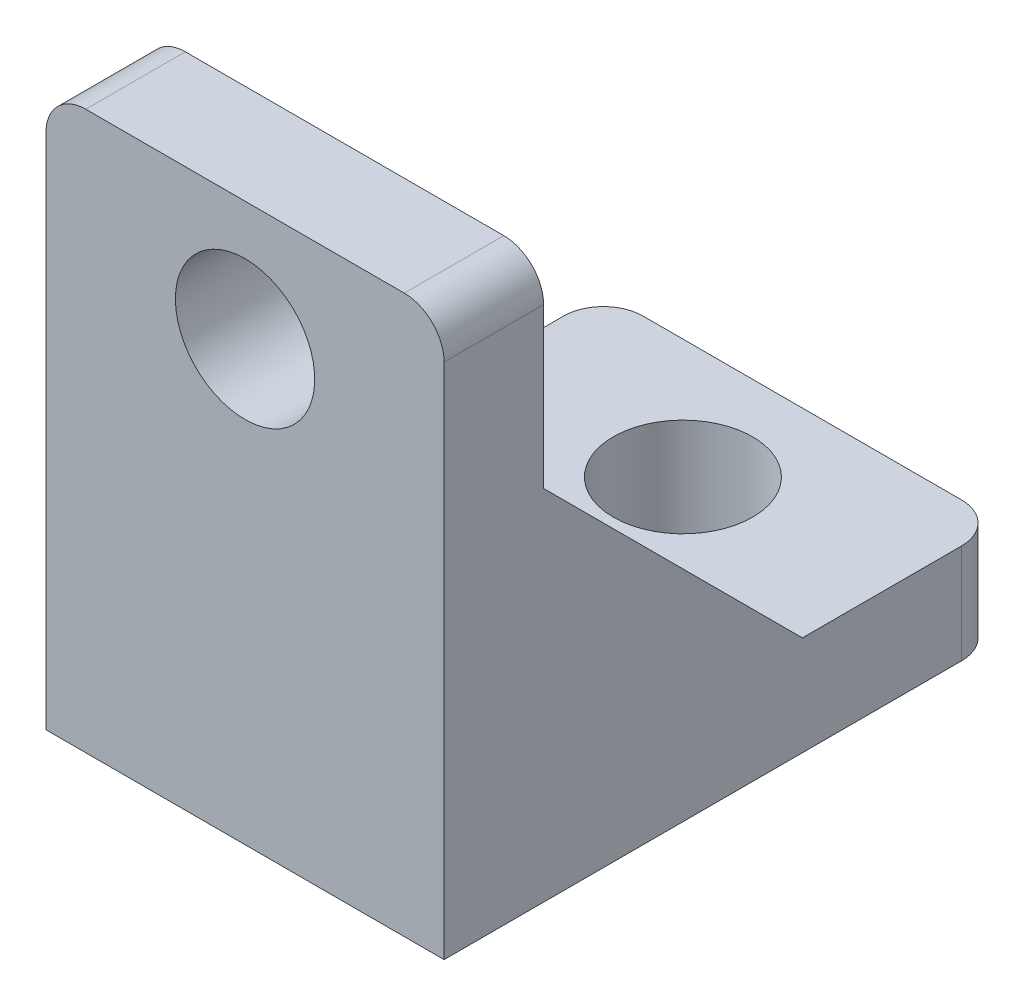
ISO-10303-21;
HEADER;
FILE_DESCRIPTION(('STEP AP214'),'2;1');
FILE_NAME('part.step','',(''),(''),'','','');
FILE_SCHEMA(('AUTOMOTIVE_DESIGN { 1 0 10303 214 1 1 1 1 }'));
ENDSEC;
DATA;
#1=APPLICATION_CONTEXT('core data for automotive mechanical design processes');
#2=APPLICATION_PROTOCOL_DEFINITION('international standard','automotive_design',2000,#1);
#3=PRODUCT_CONTEXT('',#1,'mechanical');
#4=PRODUCT('Part','Part','',(#3));
#5=PRODUCT_RELATED_PRODUCT_CATEGORY('part','',(#4));
#6=PRODUCT_DEFINITION_FORMATION('','',#4);
#7=PRODUCT_DEFINITION_CONTEXT('part definition',#1,'design');
#8=PRODUCT_DEFINITION('design','',#6,#7);
#9=PRODUCT_DEFINITION_SHAPE('','',#8);
#10=(LENGTH_UNIT() NAMED_UNIT(*) SI_UNIT(.MILLI.,.METRE.));
#11=(NAMED_UNIT(*) PLANE_ANGLE_UNIT() SI_UNIT($,.RADIAN.));
#12=(NAMED_UNIT(*) SI_UNIT($,.STERADIAN.) SOLID_ANGLE_UNIT());
#13=UNCERTAINTY_MEASURE_WITH_UNIT(LENGTH_MEASURE(1.E-05),#10,'distance_accuracy_value','');
#14=(GEOMETRIC_REPRESENTATION_CONTEXT(3) GLOBAL_UNCERTAINTY_ASSIGNED_CONTEXT((#13)) GLOBAL_UNIT_ASSIGNED_CONTEXT((#10,
#11,#12)) REPRESENTATION_CONTEXT('',''));
#15=CARTESIAN_POINT('',(0.,0.,0.));
#16=DIRECTION('',(0.,0.,1.));
#17=DIRECTION('',(1.,0.,0.));
#18=AXIS2_PLACEMENT_3D('',#15,#16,#17);
#19=CARTESIAN_POINT('',(20.,0.,-28.));
#20=DIRECTION('',(0.,1.,0.));
#21=DIRECTION('',(0.,0.,1.));
#22=AXIS2_PLACEMENT_3D('',#19,#20,#21);
#23=PLANE('',#22);
#24=CARTESIAN_POINT('',(10.,0.,-22.));
#25=DIRECTION('',(0.,1.,0.));
#26=DIRECTION('',(0.,0.,1.));
#27=AXIS2_PLACEMENT_3D('',#24,#25,#26);
#28=CIRCLE('',#27,3.5);
#29=CARTESIAN_POINT('',(10.,0.,-18.5));
#30=VERTEX_POINT('',#29);
#31=EDGE_CURVE('E300',#30,#30,#28,.F.);
#32=ORIENTED_EDGE('',*,*,#31,.F.);
#33=EDGE_LOOP('',(#32));
#34=FACE_BOUND('',#33,.T.);
#35=DIRECTION('',(0.,0.,-1.));
#36=VECTOR('',#35,1.);
#37=CARTESIAN_POINT('',(0.,0.,-28.));
#38=LINE('',#37,#36);
#39=CARTESIAN_POINT('',(0.,0.,0.));
#40=VERTEX_POINT('',#39);
#41=CARTESIAN_POINT('',(0.,0.,-26.));
#42=VERTEX_POINT('',#41);
#43=EDGE_CURVE('E171',#40,#42,#38,.T.);
#44=ORIENTED_EDGE('',*,*,#43,.T.);
#45=CARTESIAN_POINT('',(2.,0.,-26.));
#46=DIRECTION('',(0.,1.,0.));
#47=DIRECTION('',(0.,0.,1.));
#48=AXIS2_PLACEMENT_3D('',#45,#46,#47);
#49=CIRCLE('',#48,2.);
#50=CARTESIAN_POINT('',(2.,0.,-28.));
#51=VERTEX_POINT('',#50);
#52=EDGE_CURVE('E233',#42,#51,#49,.F.);
#53=ORIENTED_EDGE('',*,*,#52,.T.);
#54=DIRECTION('',(-1.,0.,0.));
#55=VECTOR('',#54,1.);
#56=CARTESIAN_POINT('',(20.,0.,-28.));
#57=LINE('',#56,#55);
#58=CARTESIAN_POINT('',(18.,0.,-28.));
#59=VERTEX_POINT('',#58);
#60=EDGE_CURVE('E204',#59,#51,#57,.T.);
#61=ORIENTED_EDGE('',*,*,#60,.F.);
#62=CARTESIAN_POINT('',(18.,0.,-26.));
#63=DIRECTION('',(0.,1.,0.));
#64=DIRECTION('',(0.,0.,1.));
#65=AXIS2_PLACEMENT_3D('',#62,#63,#64);
#66=CIRCLE('',#65,2.);
#67=CARTESIAN_POINT('',(20.,0.,-26.));
#68=VERTEX_POINT('',#67);
#69=EDGE_CURVE('E231',#59,#68,#66,.F.);
#70=ORIENTED_EDGE('',*,*,#69,.T.);
#71=DIRECTION('',(0.,0.,-1.));
#72=VECTOR('',#71,1.);
#73=CARTESIAN_POINT('',(20.,0.,-28.));
#74=LINE('',#73,#72);
#75=CARTESIAN_POINT('',(20.,0.,0.));
#76=VERTEX_POINT('',#75);
#77=EDGE_CURVE('E176',#76,#68,#74,.T.);
#78=ORIENTED_EDGE('',*,*,#77,.F.);
#79=DIRECTION('',(-1.,0.,0.));
#80=VECTOR('',#79,1.);
#81=CARTESIAN_POINT('',(20.,0.,0.));
#82=LINE('',#81,#80);
#83=EDGE_CURVE('E185',#76,#40,#82,.T.);
#84=ORIENTED_EDGE('',*,*,#83,.T.);
#85=EDGE_LOOP('',(#44,#53,#61,#70,#78,#84));
#86=FACE_BOUND('',#85,.T.);
#87=ADVANCED_FACE('F37',(#34,#86),#23,.F.);
#88=CARTESIAN_POINT('',(20.,5.,-28.));
#89=DIRECTION('',(0.,0.,1.));
#90=DIRECTION('',(1.,0.,0.));
#91=AXIS2_PLACEMENT_3D('',#88,#89,#90);
#92=PLANE('',#91);
#93=ORIENTED_EDGE('',*,*,#60,.T.);
#94=DIRECTION('',(0.,1.,0.));
#95=VECTOR('',#94,1.);
#96=CARTESIAN_POINT('',(2.,5.,-28.));
#97=LINE('',#96,#95);
#98=CARTESIAN_POINT('',(2.,5.,-28.));
#99=VERTEX_POINT('',#98);
#100=EDGE_CURVE('E224',#51,#99,#97,.T.);
#101=ORIENTED_EDGE('',*,*,#100,.T.);
#102=DIRECTION('',(-1.,0.,0.));
#103=VECTOR('',#102,1.);
#104=CARTESIAN_POINT('',(20.,5.,-28.));
#105=LINE('',#104,#103);
#106=CARTESIAN_POINT('',(18.,5.,-28.));
#107=VERTEX_POINT('',#106);
#108=EDGE_CURVE('E201',#107,#99,#105,.T.);
#109=ORIENTED_EDGE('',*,*,#108,.F.);
#110=DIRECTION('',(0.,1.,0.));
#111=VECTOR('',#110,1.);
#112=CARTESIAN_POINT('',(18.,5.,-28.));
#113=LINE('',#112,#111);
#114=EDGE_CURVE('E222',#107,#59,#113,.F.);
#115=ORIENTED_EDGE('',*,*,#114,.T.);
#116=EDGE_LOOP('',(#93,#101,#109,#115));
#117=FACE_BOUND('',#116,.T.);
#118=ADVANCED_FACE('F311',(#117),#92,.F.);
#119=CARTESIAN_POINT('',(20.,5.,-5.));
#120=DIRECTION('',(0.,-1.,0.));
#121=DIRECTION('',(0.,0.,-1.));
#122=AXIS2_PLACEMENT_3D('',#119,#120,#121);
#123=PLANE('',#122);
#124=CARTESIAN_POINT('',(10.,5.,-22.));
#125=DIRECTION('',(0.,1.,0.));
#126=DIRECTION('',(0.,0.,1.));
#127=AXIS2_PLACEMENT_3D('',#124,#125,#126);
#128=CIRCLE('',#127,3.5);
#129=CARTESIAN_POINT('',(10.,5.,-18.5));
#130=VERTEX_POINT('',#129);
#131=EDGE_CURVE('E303',#130,#130,#128,.T.);
#132=ORIENTED_EDGE('',*,*,#131,.F.);
#133=EDGE_LOOP('',(#132));
#134=FACE_BOUND('',#133,.T.);
#135=DIRECTION('',(0.,0.,1.));
#136=VECTOR('',#135,1.);
#137=CARTESIAN_POINT('',(3.,5.,-5.));
#138=LINE('',#137,#136);
#139=CARTESIAN_POINT('',(3.,5.,-18.));
#140=VERTEX_POINT('',#139);
#141=CARTESIAN_POINT('',(3.,5.,-7.));
#142=VERTEX_POINT('',#141);
#143=EDGE_CURVE('E273',#140,#142,#138,.T.);
#144=ORIENTED_EDGE('',*,*,#143,.T.);
#145=DIRECTION('',(-1.,0.,0.));
#146=VECTOR('',#145,1.);
#147=CARTESIAN_POINT('',(17.,5.,-7.));
#148=LINE('',#147,#146);
#149=CARTESIAN_POINT('',(17.,5.,-7.));
#150=VERTEX_POINT('',#149);
#151=EDGE_CURVE('E219',#142,#150,#148,.F.);
#152=ORIENTED_EDGE('',*,*,#151,.T.);
#153=DIRECTION('',(0.,0.,-1.));
#154=VECTOR('',#153,1.);
#155=CARTESIAN_POINT('',(17.,5.,-5.));
#156=LINE('',#155,#154);
#157=CARTESIAN_POINT('',(17.,5.,-18.));
#158=VERTEX_POINT('',#157);
#159=EDGE_CURVE('E154',#150,#158,#156,.T.);
#160=ORIENTED_EDGE('',*,*,#159,.T.);
#161=DIRECTION('',(1.,0.,0.));
#162=VECTOR('',#161,1.);
#163=CARTESIAN_POINT('',(17.,5.,-18.));
#164=LINE('',#163,#162);
#165=CARTESIAN_POINT('',(20.,5.,-18.));
#166=VERTEX_POINT('',#165);
#167=EDGE_CURVE('E164',#158,#166,#164,.T.);
#168=ORIENTED_EDGE('',*,*,#167,.T.);
#169=DIRECTION('',(0.,0.,1.));
#170=VECTOR('',#169,1.);
#171=CARTESIAN_POINT('',(20.,5.,-5.));
#172=LINE('',#171,#170);
#173=CARTESIAN_POINT('',(20.,5.,-26.));
#174=VERTEX_POINT('',#173);
#175=EDGE_CURVE('E179',#174,#166,#172,.T.);
#176=ORIENTED_EDGE('',*,*,#175,.F.);
#177=CARTESIAN_POINT('',(18.,5.,-26.));
#178=DIRECTION('',(0.,-1.,0.));
#179=DIRECTION('',(0.,0.,-1.));
#180=AXIS2_PLACEMENT_3D('',#177,#178,#179);
#181=CIRCLE('',#180,2.);
#182=EDGE_CURVE('E215',#174,#107,#181,.F.);
#183=ORIENTED_EDGE('',*,*,#182,.T.);
#184=ORIENTED_EDGE('',*,*,#108,.T.);
#185=CARTESIAN_POINT('',(2.,5.,-26.));
#186=DIRECTION('',(0.,-1.,0.));
#187=DIRECTION('',(0.,0.,-1.));
#188=AXIS2_PLACEMENT_3D('',#185,#186,#187);
#189=CIRCLE('',#188,2.);
#190=CARTESIAN_POINT('',(0.,5.,-26.));
#191=VERTEX_POINT('',#190);
#192=EDGE_CURVE('E217',#99,#191,#189,.F.);
#193=ORIENTED_EDGE('',*,*,#192,.T.);
#194=DIRECTION('',(0.,0.,1.));
#195=VECTOR('',#194,1.);
#196=CARTESIAN_POINT('',(0.,5.,-5.));
#197=LINE('',#196,#195);
#198=CARTESIAN_POINT('',(0.,5.,-18.));
#199=VERTEX_POINT('',#198);
#200=EDGE_CURVE('E188',#191,#199,#197,.T.);
#201=ORIENTED_EDGE('',*,*,#200,.T.);
#202=DIRECTION('',(-1.,0.,0.));
#203=VECTOR('',#202,1.);
#204=CARTESIAN_POINT('',(3.,5.,-18.));
#205=LINE('',#204,#203);
#206=EDGE_CURVE('E269',#140,#199,#205,.T.);
#207=ORIENTED_EDGE('',*,*,#206,.F.);
#208=EDGE_LOOP('',(#144,#152,#160,#168,#176,#183,#184,#193,#201,#207));
#209=FACE_BOUND('',#208,.T.);
#210=ADVANCED_FACE('F289',(#134,#209),#123,.F.);
#211=CARTESIAN_POINT('',(20.,28.,-5.));
#212=DIRECTION('',(0.,0.,1.));
#213=DIRECTION('',(0.,-1.,0.));
#214=AXIS2_PLACEMENT_3D('',#211,#212,#213);
#215=PLANE('',#214);
#216=CARTESIAN_POINT('',(10.,22.,-5.));
#217=DIRECTION('',(0.,0.,-1.));
#218=DIRECTION('',(0.,1.,0.));
#219=AXIS2_PLACEMENT_3D('',#216,#217,#218);
#220=CIRCLE('',#219,3.5);
#221=CARTESIAN_POINT('',(10.,25.5,-5.));
#222=VERTEX_POINT('',#221);
#223=EDGE_CURVE('E276',#222,#222,#220,.T.);
#224=ORIENTED_EDGE('',*,*,#223,.F.);
#225=EDGE_LOOP('',(#224));
#226=FACE_BOUND('',#225,.T.);
#227=DIRECTION('',(0.,-1.,0.));
#228=VECTOR('',#227,1.);
#229=CARTESIAN_POINT('',(17.,18.,-5.));
#230=LINE('',#229,#228);
#231=CARTESIAN_POINT('',(17.,18.,-5.));
#232=VERTEX_POINT('',#231);
#233=CARTESIAN_POINT('',(17.,7.,-5.));
#234=VERTEX_POINT('',#233);
#235=EDGE_CURVE('E143',#232,#234,#230,.T.);
#236=ORIENTED_EDGE('',*,*,#235,.T.);
#237=DIRECTION('',(-1.,0.,0.));
#238=VECTOR('',#237,1.);
#239=CARTESIAN_POINT('',(3.,7.,-5.));
#240=LINE('',#239,#238);
#241=CARTESIAN_POINT('',(3.,7.,-5.));
#242=VERTEX_POINT('',#241);
#243=EDGE_CURVE('E211',#234,#242,#240,.T.);
#244=ORIENTED_EDGE('',*,*,#243,.T.);
#245=DIRECTION('',(0.,1.,0.));
#246=VECTOR('',#245,1.);
#247=CARTESIAN_POINT('',(3.,18.,-5.));
#248=LINE('',#247,#246);
#249=CARTESIAN_POINT('',(3.,18.,-5.));
#250=VERTEX_POINT('',#249);
#251=EDGE_CURVE('E280',#242,#250,#248,.T.);
#252=ORIENTED_EDGE('',*,*,#251,.T.);
#253=DIRECTION('',(-1.,0.,0.));
#254=VECTOR('',#253,1.);
#255=CARTESIAN_POINT('',(3.,18.,-5.));
#256=LINE('',#255,#254);
#257=CARTESIAN_POINT('',(0.,18.,-5.));
#258=VERTEX_POINT('',#257);
#259=EDGE_CURVE('E260',#250,#258,#256,.T.);
#260=ORIENTED_EDGE('',*,*,#259,.T.);
#261=DIRECTION('',(0.,1.,0.));
#262=VECTOR('',#261,1.);
#263=CARTESIAN_POINT('',(0.,28.,-5.));
#264=LINE('',#263,#262);
#265=CARTESIAN_POINT('',(0.,26.,-5.));
#266=VERTEX_POINT('',#265);
#267=EDGE_CURVE('E190',#258,#266,#264,.T.);
#268=ORIENTED_EDGE('',*,*,#267,.T.);
#269=CARTESIAN_POINT('',(2.,26.,-5.));
#270=DIRECTION('',(0.,0.,1.));
#271=DIRECTION('',(0.,-1.,0.));
#272=AXIS2_PLACEMENT_3D('',#269,#270,#271);
#273=CIRCLE('',#272,2.);
#274=CARTESIAN_POINT('',(2.,28.,-5.));
#275=VERTEX_POINT('',#274);
#276=EDGE_CURVE('E209',#266,#275,#273,.F.);
#277=ORIENTED_EDGE('',*,*,#276,.T.);
#278=DIRECTION('',(-1.,0.,0.));
#279=VECTOR('',#278,1.);
#280=CARTESIAN_POINT('',(20.,28.,-5.));
#281=LINE('',#280,#279);
#282=CARTESIAN_POINT('',(18.,28.,-5.));
#283=VERTEX_POINT('',#282);
#284=EDGE_CURVE('E198',#283,#275,#281,.T.);
#285=ORIENTED_EDGE('',*,*,#284,.F.);
#286=CARTESIAN_POINT('',(18.,26.,-5.));
#287=DIRECTION('',(0.,0.,1.));
#288=DIRECTION('',(0.,-1.,0.));
#289=AXIS2_PLACEMENT_3D('',#286,#287,#288);
#290=CIRCLE('',#289,2.);
#291=CARTESIAN_POINT('',(20.,26.,-5.));
#292=VERTEX_POINT('',#291);
#293=EDGE_CURVE('E207',#283,#292,#290,.F.);
#294=ORIENTED_EDGE('',*,*,#293,.T.);
#295=DIRECTION('',(0.,1.,0.));
#296=VECTOR('',#295,1.);
#297=CARTESIAN_POINT('',(20.,28.,-5.));
#298=LINE('',#297,#296);
#299=CARTESIAN_POINT('',(20.,18.,-5.));
#300=VERTEX_POINT('',#299);
#301=EDGE_CURVE('E169',#300,#292,#298,.T.);
#302=ORIENTED_EDGE('',*,*,#301,.F.);
#303=DIRECTION('',(1.,0.,0.));
#304=VECTOR('',#303,1.);
#305=CARTESIAN_POINT('',(17.,18.,-5.));
#306=LINE('',#305,#304);
#307=EDGE_CURVE('E161',#232,#300,#306,.T.);
#308=ORIENTED_EDGE('',*,*,#307,.F.);
#309=EDGE_LOOP('',(#236,#244,#252,#260,#268,#277,#285,#294,#302,#308));
#310=FACE_BOUND('',#309,.T.);
#311=ADVANCED_FACE('F167',(#226,#310),#215,.F.);
#312=CARTESIAN_POINT('',(20.,28.,0.));
#313=DIRECTION('',(0.,-1.,0.));
#314=DIRECTION('',(0.,0.,-1.));
#315=AXIS2_PLACEMENT_3D('',#312,#313,#314);
#316=PLANE('',#315);
#317=ORIENTED_EDGE('',*,*,#284,.T.);
#318=DIRECTION('',(0.,0.,1.));
#319=VECTOR('',#318,1.);
#320=CARTESIAN_POINT('',(2.,28.,0.));
#321=LINE('',#320,#319);
#322=CARTESIAN_POINT('',(2.,28.,0.));
#323=VERTEX_POINT('',#322);
#324=EDGE_CURVE('E243',#275,#323,#321,.T.);
#325=ORIENTED_EDGE('',*,*,#324,.T.);
#326=DIRECTION('',(-1.,0.,0.));
#327=VECTOR('',#326,1.);
#328=CARTESIAN_POINT('',(20.,28.,0.));
#329=LINE('',#328,#327);
#330=CARTESIAN_POINT('',(18.,28.,0.));
#331=VERTEX_POINT('',#330);
#332=EDGE_CURVE('E196',#331,#323,#329,.T.);
#333=ORIENTED_EDGE('',*,*,#332,.F.);
#334=DIRECTION('',(0.,0.,1.));
#335=VECTOR('',#334,1.);
#336=CARTESIAN_POINT('',(18.,28.,0.));
#337=LINE('',#336,#335);
#338=EDGE_CURVE('E241',#331,#283,#337,.F.);
#339=ORIENTED_EDGE('',*,*,#338,.T.);
#340=EDGE_LOOP('',(#317,#325,#333,#339));
#341=FACE_BOUND('',#340,.T.);
#342=ADVANCED_FACE('F245',(#341),#316,.F.);
#343=CARTESIAN_POINT('',(20.,0.,0.));
#344=DIRECTION('',(0.,0.,-1.));
#345=DIRECTION('',(-1.,0.,0.));
#346=AXIS2_PLACEMENT_3D('',#343,#344,#345);
#347=PLANE('',#346);
#348=CARTESIAN_POINT('',(10.,22.,0.));
#349=DIRECTION('',(0.,0.,-1.));
#350=DIRECTION('',(-1.,0.,0.));
#351=AXIS2_PLACEMENT_3D('',#348,#349,#350);
#352=CIRCLE('',#351,3.5);
#353=CARTESIAN_POINT('',(6.5,22.,0.));
#354=VERTEX_POINT('',#353);
#355=EDGE_CURVE('E271',#354,#354,#352,.F.);
#356=ORIENTED_EDGE('',*,*,#355,.F.);
#357=EDGE_LOOP('',(#356));
#358=FACE_BOUND('',#357,.T.);
#359=ORIENTED_EDGE('',*,*,#332,.T.);
#360=CARTESIAN_POINT('',(2.,26.,0.));
#361=DIRECTION('',(0.,0.,-1.));
#362=DIRECTION('',(-1.,0.,0.));
#363=AXIS2_PLACEMENT_3D('',#360,#361,#362);
#364=CIRCLE('',#363,2.);
#365=CARTESIAN_POINT('',(0.,26.,0.));
#366=VERTEX_POINT('',#365);
#367=EDGE_CURVE('E11',#323,#366,#364,.F.);
#368=ORIENTED_EDGE('',*,*,#367,.T.);
#369=DIRECTION('',(0.,-1.,0.));
#370=VECTOR('',#369,1.);
#371=CARTESIAN_POINT('',(0.,0.,0.));
#372=LINE('',#371,#370);
#373=EDGE_CURVE('E180',#366,#40,#372,.T.);
#374=ORIENTED_EDGE('',*,*,#373,.T.);
#375=ORIENTED_EDGE('',*,*,#83,.F.);
#376=DIRECTION('',(0.,-1.,0.));
#377=VECTOR('',#376,1.);
#378=CARTESIAN_POINT('',(20.,0.,0.));
#379=LINE('',#378,#377);
#380=CARTESIAN_POINT('',(20.,26.,0.));
#381=VERTEX_POINT('',#380);
#382=EDGE_CURVE('E183',#381,#76,#379,.T.);
#383=ORIENTED_EDGE('',*,*,#382,.F.);
#384=CARTESIAN_POINT('',(18.,26.,0.));
#385=DIRECTION('',(0.,0.,-1.));
#386=DIRECTION('',(-1.,0.,0.));
#387=AXIS2_PLACEMENT_3D('',#384,#385,#386);
#388=CIRCLE('',#387,2.);
#389=EDGE_CURVE('E45',#381,#331,#388,.F.);
#390=ORIENTED_EDGE('',*,*,#389,.T.);
#391=EDGE_LOOP('',(#359,#368,#374,#375,#383,#390));
#392=FACE_BOUND('',#391,.T.);
#393=ADVANCED_FACE('F249',(#358,#392),#347,.F.);
#394=CARTESIAN_POINT('',(20.,0.,0.));
#395=DIRECTION('',(-1.,0.,0.));
#396=DIRECTION('',(0.,0.,1.));
#397=AXIS2_PLACEMENT_3D('',#394,#395,#396);
#398=PLANE('',#397);
#399=ORIENTED_EDGE('',*,*,#77,.T.);
#400=DIRECTION('',(0.,1.,0.));
#401=VECTOR('',#400,1.);
#402=CARTESIAN_POINT('',(20.,0.,-26.));
#403=LINE('',#402,#401);
#404=EDGE_CURVE('E238',#68,#174,#403,.T.);
#405=ORIENTED_EDGE('',*,*,#404,.T.);
#406=ORIENTED_EDGE('',*,*,#175,.T.);
#407=DIRECTION('',(0.,0.707106781186547,0.707106781186548));
#408=VECTOR('',#407,1.);
#409=CARTESIAN_POINT('',(20.,5.,-18.));
#410=LINE('',#409,#408);
#411=EDGE_CURVE('E165',#166,#300,#410,.T.);
#412=ORIENTED_EDGE('',*,*,#411,.T.);
#413=ORIENTED_EDGE('',*,*,#301,.T.);
#414=DIRECTION('',(0.,0.,1.));
#415=VECTOR('',#414,1.);
#416=CARTESIAN_POINT('',(20.,26.,0.));
#417=LINE('',#416,#415);
#418=EDGE_CURVE('E235',#292,#381,#417,.T.);
#419=ORIENTED_EDGE('',*,*,#418,.T.);
#420=ORIENTED_EDGE('',*,*,#382,.T.);
#421=EDGE_LOOP('',(#399,#405,#406,#412,#413,#419,#420));
#422=FACE_BOUND('',#421,.T.);
#423=ADVANCED_FACE('F284',(#422),#398,.F.);
#424=CARTESIAN_POINT('',(0.,0.,0.));
#425=DIRECTION('',(-1.,0.,0.));
#426=DIRECTION('',(0.,0.,1.));
#427=AXIS2_PLACEMENT_3D('',#424,#425,#426);
#428=PLANE('',#427);
#429=ORIENTED_EDGE('',*,*,#200,.F.);
#430=DIRECTION('',(0.,1.,0.));
#431=VECTOR('',#430,1.);
#432=CARTESIAN_POINT('',(0.,0.,-26.));
#433=LINE('',#432,#431);
#434=EDGE_CURVE('E229',#191,#42,#433,.F.);
#435=ORIENTED_EDGE('',*,*,#434,.T.);
#436=ORIENTED_EDGE('',*,*,#43,.F.);
#437=ORIENTED_EDGE('',*,*,#373,.F.);
#438=DIRECTION('',(0.,0.,1.));
#439=VECTOR('',#438,1.);
#440=CARTESIAN_POINT('',(0.,26.,-5.));
#441=LINE('',#440,#439);
#442=EDGE_CURVE('E227',#366,#266,#441,.F.);
#443=ORIENTED_EDGE('',*,*,#442,.T.);
#444=ORIENTED_EDGE('',*,*,#267,.F.);
#445=DIRECTION('',(0.,-0.707106781186547,-0.707106781186548));
#446=VECTOR('',#445,1.);
#447=CARTESIAN_POINT('',(0.,5.,-18.));
#448=LINE('',#447,#446);
#449=EDGE_CURVE('E263',#258,#199,#448,.T.);
#450=ORIENTED_EDGE('',*,*,#449,.T.);
#451=EDGE_LOOP('',(#429,#435,#436,#437,#443,#444,#450));
#452=FACE_BOUND('',#451,.T.);
#453=ADVANCED_FACE('F255',(#452),#428,.T.);
#454=CARTESIAN_POINT('',(17.,5.,-18.));
#455=DIRECTION('',(0.,0.707106781186548,-0.707106781186547));
#456=DIRECTION('',(0.,0.707106781186547,0.707106781186548));
#457=AXIS2_PLACEMENT_3D('',#454,#455,#456);
#458=PLANE('',#457);
#459=ORIENTED_EDGE('',*,*,#411,.F.);
#460=ORIENTED_EDGE('',*,*,#167,.F.);
#461=DIRECTION('',(0.,0.707106781186547,0.707106781186548));
#462=VECTOR('',#461,1.);
#463=CARTESIAN_POINT('',(17.,5.,-18.));
#464=LINE('',#463,#462);
#465=EDGE_CURVE('E147',#158,#232,#464,.T.);
#466=ORIENTED_EDGE('',*,*,#465,.T.);
#467=ORIENTED_EDGE('',*,*,#307,.T.);
#468=EDGE_LOOP('',(#459,#460,#466,#467));
#469=FACE_BOUND('',#468,.T.);
#470=ADVANCED_FACE('F160',(#469),#458,.T.);
#471=CARTESIAN_POINT('',(17.,0.,0.));
#472=DIRECTION('',(1.,0.,0.));
#473=DIRECTION('',(0.,0.,-1.));
#474=AXIS2_PLACEMENT_3D('',#471,#472,#473);
#475=PLANE('',#474);
#476=ORIENTED_EDGE('',*,*,#159,.F.);
#477=CARTESIAN_POINT('',(17.,7.,-7.));
#478=DIRECTION('',(1.,0.,0.));
#479=DIRECTION('',(0.,0.,-1.));
#480=AXIS2_PLACEMENT_3D('',#477,#478,#479);
#481=CIRCLE('',#480,2.);
#482=EDGE_CURVE('E149',#150,#234,#481,.F.);
#483=ORIENTED_EDGE('',*,*,#482,.T.);
#484=ORIENTED_EDGE('',*,*,#235,.F.);
#485=ORIENTED_EDGE('',*,*,#465,.F.);
#486=EDGE_LOOP('',(#476,#483,#484,#485));
#487=FACE_BOUND('',#486,.T.);
#488=ADVANCED_FACE('F146',(#487),#475,.F.);
#489=CARTESIAN_POINT('',(3.,5.,-18.));
#490=DIRECTION('',(0.,0.707106781186548,-0.707106781186547));
#491=DIRECTION('',(0.,0.707106781186547,0.707106781186548));
#492=AXIS2_PLACEMENT_3D('',#489,#490,#491);
#493=PLANE('',#492);
#494=ORIENTED_EDGE('',*,*,#449,.F.);
#495=ORIENTED_EDGE('',*,*,#259,.F.);
#496=DIRECTION('',(0.,-0.707106781186547,-0.707106781186548));
#497=VECTOR('',#496,1.);
#498=CARTESIAN_POINT('',(3.,5.,-18.));
#499=LINE('',#498,#497);
#500=EDGE_CURVE('E270',#250,#140,#499,.T.);
#501=ORIENTED_EDGE('',*,*,#500,.T.);
#502=ORIENTED_EDGE('',*,*,#206,.T.);
#503=EDGE_LOOP('',(#494,#495,#501,#502));
#504=FACE_BOUND('',#503,.T.);
#505=ADVANCED_FACE('F266',(#504),#493,.T.);
#506=CARTESIAN_POINT('',(3.,0.,0.));
#507=DIRECTION('',(1.,0.,0.));
#508=DIRECTION('',(0.,0.,-1.));
#509=AXIS2_PLACEMENT_3D('',#506,#507,#508);
#510=PLANE('',#509);
#511=ORIENTED_EDGE('',*,*,#251,.F.);
#512=CARTESIAN_POINT('',(3.,7.,-7.));
#513=DIRECTION('',(1.,0.,0.));
#514=DIRECTION('',(0.,0.,-1.));
#515=AXIS2_PLACEMENT_3D('',#512,#513,#514);
#516=CIRCLE('',#515,2.);
#517=EDGE_CURVE('E213',#242,#142,#516,.T.);
#518=ORIENTED_EDGE('',*,*,#517,.T.);
#519=ORIENTED_EDGE('',*,*,#143,.F.);
#520=ORIENTED_EDGE('',*,*,#500,.F.);
#521=EDGE_LOOP('',(#511,#518,#519,#520));
#522=FACE_BOUND('',#521,.T.);
#523=ADVANCED_FACE('F295',(#522),#510,.T.);
#524=CARTESIAN_POINT('',(20.,7.,-7.));
#525=DIRECTION('',(1.,0.,0.));
#526=DIRECTION('',(0.,0.,-1.));
#527=AXIS2_PLACEMENT_3D('',#524,#525,#526);
#528=CYLINDRICAL_SURFACE('',#527,2.);
#529=ORIENTED_EDGE('',*,*,#482,.F.);
#530=ORIENTED_EDGE('',*,*,#151,.F.);
#531=ORIENTED_EDGE('',*,*,#517,.F.);
#532=ORIENTED_EDGE('',*,*,#243,.F.);
#533=EDGE_LOOP('',(#529,#530,#531,#532));
#534=FACE_BOUND('',#533,.T.);
#535=ADVANCED_FACE('F292',(#534),#528,.F.);
#536=CARTESIAN_POINT('',(2.,5.,-26.));
#537=DIRECTION('',(0.,-1.,0.));
#538=DIRECTION('',(0.,0.,-1.));
#539=AXIS2_PLACEMENT_3D('',#536,#537,#538);
#540=CYLINDRICAL_SURFACE('',#539,2.);
#541=ORIENTED_EDGE('',*,*,#52,.F.);
#542=ORIENTED_EDGE('',*,*,#434,.F.);
#543=ORIENTED_EDGE('',*,*,#192,.F.);
#544=ORIENTED_EDGE('',*,*,#100,.F.);
#545=EDGE_LOOP('',(#541,#542,#543,#544));
#546=FACE_BOUND('',#545,.T.);
#547=ADVANCED_FACE('F331',(#546),#540,.T.);
#548=CARTESIAN_POINT('',(18.,0.,-26.));
#549=DIRECTION('',(0.,1.,0.));
#550=DIRECTION('',(0.,0.,1.));
#551=AXIS2_PLACEMENT_3D('',#548,#549,#550);
#552=CYLINDRICAL_SURFACE('',#551,2.);
#553=ORIENTED_EDGE('',*,*,#69,.F.);
#554=ORIENTED_EDGE('',*,*,#114,.F.);
#555=ORIENTED_EDGE('',*,*,#182,.F.);
#556=ORIENTED_EDGE('',*,*,#404,.F.);
#557=EDGE_LOOP('',(#553,#554,#555,#556));
#558=FACE_BOUND('',#557,.T.);
#559=ADVANCED_FACE('F334',(#558),#552,.T.);
#560=CARTESIAN_POINT('',(2.,26.,0.));
#561=DIRECTION('',(0.,0.,-1.));
#562=DIRECTION('',(-1.,0.,0.));
#563=AXIS2_PLACEMENT_3D('',#560,#561,#562);
#564=CYLINDRICAL_SURFACE('',#563,2.);
#565=ORIENTED_EDGE('',*,*,#276,.F.);
#566=ORIENTED_EDGE('',*,*,#442,.F.);
#567=ORIENTED_EDGE('',*,*,#367,.F.);
#568=ORIENTED_EDGE('',*,*,#324,.F.);
#569=EDGE_LOOP('',(#565,#566,#567,#568));
#570=FACE_BOUND('',#569,.T.);
#571=ADVANCED_FACE('F257',(#570),#564,.T.);
#572=CARTESIAN_POINT('',(18.,26.,0.));
#573=DIRECTION('',(0.,0.,1.));
#574=DIRECTION('',(1.,0.,0.));
#575=AXIS2_PLACEMENT_3D('',#572,#573,#574);
#576=CYLINDRICAL_SURFACE('',#575,2.);
#577=ORIENTED_EDGE('',*,*,#293,.F.);
#578=ORIENTED_EDGE('',*,*,#338,.F.);
#579=ORIENTED_EDGE('',*,*,#389,.F.);
#580=ORIENTED_EDGE('',*,*,#418,.F.);
#581=EDGE_LOOP('',(#577,#578,#579,#580));
#582=FACE_BOUND('',#581,.T.);
#583=ADVANCED_FACE('F39',(#582),#576,.T.);
#584=CARTESIAN_POINT('',(10.,22.,0.00100000000000273));
#585=DIRECTION('',(0.,0.,-1.));
#586=DIRECTION('',(0.,1.,0.));
#587=AXIS2_PLACEMENT_3D('',#584,#585,#586);
#588=CYLINDRICAL_SURFACE('',#587,3.5);
#589=ORIENTED_EDGE('',*,*,#223,.T.);
#590=EDGE_LOOP('',(#589));
#591=FACE_BOUND('',#590,.T.);
#592=ORIENTED_EDGE('',*,*,#355,.T.);
#593=EDGE_LOOP('',(#592));
#594=FACE_BOUND('',#593,.T.);
#595=ADVANCED_FACE('F342',(#591,#594),#588,.F.);
#596=CARTESIAN_POINT('',(10.,-0.00100000000000013,-22.));
#597=DIRECTION('',(0.,1.,0.));
#598=DIRECTION('',(0.,0.,1.));
#599=AXIS2_PLACEMENT_3D('',#596,#597,#598);
#600=CYLINDRICAL_SURFACE('',#599,3.5);
#601=ORIENTED_EDGE('',*,*,#131,.T.);
#602=EDGE_LOOP('',(#601));
#603=FACE_BOUND('',#602,.T.);
#604=ORIENTED_EDGE('',*,*,#31,.T.);
#605=EDGE_LOOP('',(#604));
#606=FACE_BOUND('',#605,.T.);
#607=ADVANCED_FACE('F307',(#603,#606),#600,.F.);
#608=CLOSED_SHELL('',(#87,#118,#210,#311,#342,#393,#423,#453,#470,#488,#505,#523,#535,#547,#559,
#571,#583,#595,#607));
#609=MANIFOLD_SOLID_BREP('B2',#608);
#610=ADVANCED_BREP_SHAPE_REPRESENTATION('',(#18,#609),#14);
#611=SHAPE_DEFINITION_REPRESENTATION(#9,#610);
ENDSEC;
END-ISO-10303-21;
